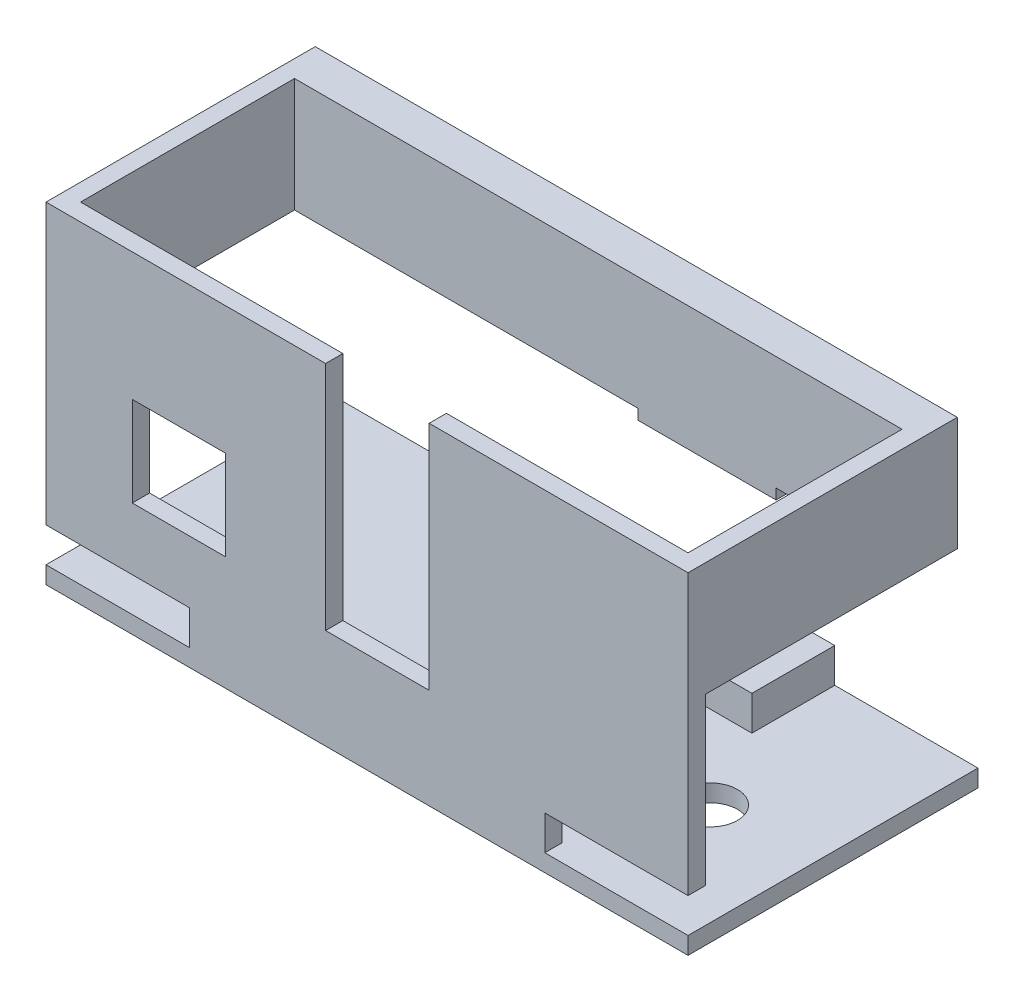
ISO-10303-21;
HEADER;
FILE_DESCRIPTION(('STEP AP214'),'2;1');
FILE_NAME('part.step','',(''),(''),'','','');
FILE_SCHEMA(('AUTOMOTIVE_DESIGN { 1 0 10303 214 1 1 1 1 }'));
ENDSEC;
DATA;
#1=APPLICATION_CONTEXT('core data for automotive mechanical design processes');
#2=APPLICATION_PROTOCOL_DEFINITION('international standard','automotive_design',2000,#1);
#3=PRODUCT_CONTEXT('',#1,'mechanical');
#4=PRODUCT('Part','Part','',(#3));
#5=PRODUCT_RELATED_PRODUCT_CATEGORY('part','',(#4));
#6=PRODUCT_DEFINITION_FORMATION('','',#4);
#7=PRODUCT_DEFINITION_CONTEXT('part definition',#1,'design');
#8=PRODUCT_DEFINITION('design','',#6,#7);
#9=PRODUCT_DEFINITION_SHAPE('','',#8);
#10=(LENGTH_UNIT() NAMED_UNIT(*) SI_UNIT(.MILLI.,.METRE.));
#11=(NAMED_UNIT(*) PLANE_ANGLE_UNIT() SI_UNIT($,.RADIAN.));
#12=(NAMED_UNIT(*) SI_UNIT($,.STERADIAN.) SOLID_ANGLE_UNIT());
#13=UNCERTAINTY_MEASURE_WITH_UNIT(LENGTH_MEASURE(1.E-05),#10,'distance_accuracy_value','');
#14=(GEOMETRIC_REPRESENTATION_CONTEXT(3) GLOBAL_UNCERTAINTY_ASSIGNED_CONTEXT((#13)) GLOBAL_UNIT_ASSIGNED_CONTEXT((#10,
#11,#12)) REPRESENTATION_CONTEXT('',''));
#15=CARTESIAN_POINT('',(0.,0.,0.));
#16=DIRECTION('',(0.,0.,1.));
#17=DIRECTION('',(1.,0.,0.));
#18=AXIS2_PLACEMENT_3D('',#15,#16,#17);
#19=CARTESIAN_POINT('',(45.25,15.75,-21.));
#20=DIRECTION('',(0.,1.,0.));
#21=DIRECTION('',(0.,0.,1.));
#22=AXIS2_PLACEMENT_3D('',#19,#20,#21);
#23=PLANE('',#22);
#24=DIRECTION('',(0.,0.,1.));
#25=VECTOR('',#24,1.);
#26=CARTESIAN_POINT('',(34.875,15.75,-19.5));
#27=LINE('',#26,#25);
#28=CARTESIAN_POINT('',(34.875,15.75,-19.5));
#29=VERTEX_POINT('',#28);
#30=CARTESIAN_POINT('',(34.875,15.75,-16.75));
#31=VERTEX_POINT('',#30);
#32=EDGE_CURVE('E48',#29,#31,#27,.T.);
#33=ORIENTED_EDGE('',*,*,#32,.F.);
#34=DIRECTION('',(1.,0.,0.));
#35=VECTOR('',#34,1.);
#36=CARTESIAN_POINT('',(45.25,15.75,-19.5));
#37=LINE('',#36,#35);
#38=CARTESIAN_POINT('',(45.25,15.75,-19.5));
#39=VERTEX_POINT('',#38);
#40=EDGE_CURVE('E41',#29,#39,#37,.T.);
#41=ORIENTED_EDGE('',*,*,#40,.T.);
#42=DIRECTION('',(0.,0.,-1.));
#43=VECTOR('',#42,1.);
#44=CARTESIAN_POINT('',(45.25,15.75,-21.));
#45=LINE('',#44,#43);
#46=CARTESIAN_POINT('',(45.25,15.75,-1.25));
#47=VERTEX_POINT('',#46);
#48=EDGE_CURVE('E434',#47,#39,#45,.T.);
#49=ORIENTED_EDGE('',*,*,#48,.F.);
#50=DIRECTION('',(-1.,0.,0.));
#51=VECTOR('',#50,1.);
#52=CARTESIAN_POINT('',(45.25,15.75,-1.25));
#53=LINE('',#52,#51);
#54=CARTESIAN_POINT('',(44.,15.75,-1.25));
#55=VERTEX_POINT('',#54);
#56=EDGE_CURVE('E442',#47,#55,#53,.T.);
#57=ORIENTED_EDGE('',*,*,#56,.T.);
#58=DIRECTION('',(0.,0.,1.));
#59=VECTOR('',#58,1.);
#60=CARTESIAN_POINT('',(44.,15.75,-21.));
#61=LINE('',#60,#59);
#62=CARTESIAN_POINT('',(44.,15.75,-16.75));
#63=VERTEX_POINT('',#62);
#64=EDGE_CURVE('E445',#63,#55,#61,.T.);
#65=ORIENTED_EDGE('',*,*,#64,.F.);
#66=DIRECTION('',(-1.,0.,0.));
#67=VECTOR('',#66,1.);
#68=CARTESIAN_POINT('',(44.,15.75,-16.75));
#69=LINE('',#68,#67);
#70=EDGE_CURVE('E288',#63,#31,#69,.T.);
#71=ORIENTED_EDGE('',*,*,#70,.T.);
#72=EDGE_LOOP('',(#33,#41,#49,#57,#65,#71));
#73=FACE_BOUND('',#72,.T.);
#74=ADVANCED_FACE('F33',(#73),#23,.F.);
#75=CARTESIAN_POINT('',(0.,0.,-21.));
#76=DIRECTION('',(-1.,0.,0.));
#77=DIRECTION('',(0.,0.,1.));
#78=AXIS2_PLACEMENT_3D('',#75,#76,#77);
#79=PLANE('',#78);
#80=DIRECTION('',(0.,-1.,0.));
#81=VECTOR('',#80,1.);
#82=CARTESIAN_POINT('',(0.,24.,-16.75));
#83=LINE('',#82,#81);
#84=CARTESIAN_POINT('',(0.,24.,-16.75));
#85=VERTEX_POINT('',#84);
#86=CARTESIAN_POINT('',(0.,15.75,-16.75));
#87=VERTEX_POINT('',#86);
#88=EDGE_CURVE('E278',#85,#87,#83,.T.);
#89=ORIENTED_EDGE('',*,*,#88,.F.);
#90=DIRECTION('',(0.,0.,1.));
#91=VECTOR('',#90,1.);
#92=CARTESIAN_POINT('',(0.,24.,-21.));
#93=LINE('',#92,#91);
#94=CARTESIAN_POINT('',(0.,24.,-1.25));
#95=VERTEX_POINT('',#94);
#96=EDGE_CURVE('E465',#85,#95,#93,.T.);
#97=ORIENTED_EDGE('',*,*,#96,.T.);
#98=DIRECTION('',(0.,-1.,0.));
#99=VECTOR('',#98,1.);
#100=CARTESIAN_POINT('',(0.,0.,-1.25));
#101=LINE('',#100,#99);
#102=CARTESIAN_POINT('',(0.,15.75,-1.25));
#103=VERTEX_POINT('',#102);
#104=EDGE_CURVE('E453',#95,#103,#101,.T.);
#105=ORIENTED_EDGE('',*,*,#104,.T.);
#106=DIRECTION('',(0.,0.,-1.));
#107=VECTOR('',#106,1.);
#108=CARTESIAN_POINT('',(0.,15.75,-21.));
#109=LINE('',#108,#107);
#110=EDGE_CURVE('E447',#103,#87,#109,.T.);
#111=ORIENTED_EDGE('',*,*,#110,.T.);
#112=EDGE_LOOP('',(#89,#97,#105,#111));
#113=FACE_BOUND('',#112,.T.);
#114=ADVANCED_FACE('F535',(#113),#79,.F.);
#115=CARTESIAN_POINT('',(44.,0.,-21.));
#116=DIRECTION('',(1.,0.,0.));
#117=DIRECTION('',(0.,0.,-1.));
#118=AXIS2_PLACEMENT_3D('',#115,#116,#117);
#119=PLANE('',#118);
#120=DIRECTION('',(0.,-1.,0.));
#121=VECTOR('',#120,1.);
#122=CARTESIAN_POINT('',(44.,24.,-16.75));
#123=LINE('',#122,#121);
#124=CARTESIAN_POINT('',(44.,24.,-16.75));
#125=VERTEX_POINT('',#124);
#126=EDGE_CURVE('E280',#125,#63,#123,.T.);
#127=ORIENTED_EDGE('',*,*,#126,.T.);
#128=ORIENTED_EDGE('',*,*,#64,.T.);
#129=DIRECTION('',(0.,1.,0.));
#130=VECTOR('',#129,1.);
#131=CARTESIAN_POINT('',(44.,0.,-1.25));
#132=LINE('',#131,#130);
#133=CARTESIAN_POINT('',(44.,24.,-1.25));
#134=VERTEX_POINT('',#133);
#135=EDGE_CURVE('E452',#55,#134,#132,.T.);
#136=ORIENTED_EDGE('',*,*,#135,.T.);
#137=DIRECTION('',(0.,0.,1.));
#138=VECTOR('',#137,1.);
#139=CARTESIAN_POINT('',(44.,24.,-21.));
#140=LINE('',#139,#138);
#141=EDGE_CURVE('E464',#125,#134,#140,.T.);
#142=ORIENTED_EDGE('',*,*,#141,.F.);
#143=EDGE_LOOP('',(#127,#128,#136,#142));
#144=FACE_BOUND('',#143,.T.);
#145=ADVANCED_FACE('F604',(#144),#119,.F.);
#146=CARTESIAN_POINT('',(-1.25,1.25,-21.));
#147=DIRECTION('',(0.,-1.,0.));
#148=DIRECTION('',(0.,0.,-1.));
#149=AXIS2_PLACEMENT_3D('',#146,#147,#148);
#150=PLANE('',#149);
#151=CARTESIAN_POINT('',(6.125,1.25,-8.99999999999999));
#152=DIRECTION('',(0.,-1.,0.));
#153=DIRECTION('',(0.,0.,-1.));
#154=AXIS2_PLACEMENT_3D('',#151,#152,#153);
#155=CIRCLE('',#154,1.95);
#156=CARTESIAN_POINT('',(6.125,1.25,-10.95));
#157=VERTEX_POINT('',#156);
#158=EDGE_CURVE('E376',#157,#157,#155,.T.);
#159=ORIENTED_EDGE('',*,*,#158,.T.);
#160=EDGE_LOOP('',(#159));
#161=FACE_BOUND('',#160,.T.);
#162=CARTESIAN_POINT('',(37.875,1.25,-8.99999999999999));
#163=DIRECTION('',(0.,-1.,0.));
#164=DIRECTION('',(0.,0.,-1.));
#165=AXIS2_PLACEMENT_3D('',#162,#163,#164);
#166=CIRCLE('',#165,1.95);
#167=CARTESIAN_POINT('',(37.875,1.25,-10.95));
#168=VERTEX_POINT('',#167);
#169=EDGE_CURVE('E367',#168,#168,#166,.F.);
#170=ORIENTED_EDGE('',*,*,#169,.F.);
#171=EDGE_LOOP('',(#170));
#172=FACE_BOUND('',#171,.T.);
#173=DIRECTION('',(0.,0.,-1.));
#174=VECTOR('',#173,1.);
#175=CARTESIAN_POINT('',(34.875,1.25,-21.));
#176=LINE('',#175,#174);
#177=CARTESIAN_POINT('',(34.875,1.25,-15.));
#178=VERTEX_POINT('',#177);
#179=CARTESIAN_POINT('',(34.875,1.25,-21.));
#180=VERTEX_POINT('',#179);
#181=EDGE_CURVE('E301',#178,#180,#176,.T.);
#182=ORIENTED_EDGE('',*,*,#181,.F.);
#183=DIRECTION('',(1.,0.,0.));
#184=VECTOR('',#183,1.);
#185=CARTESIAN_POINT('',(34.875,1.25,-15.));
#186=LINE('',#185,#184);
#187=CARTESIAN_POINT('',(15.375,1.25,-15.));
#188=VERTEX_POINT('',#187);
#189=EDGE_CURVE('E306',#188,#178,#186,.T.);
#190=ORIENTED_EDGE('',*,*,#189,.F.);
#191=DIRECTION('',(0.,0.,1.));
#192=VECTOR('',#191,1.);
#193=CARTESIAN_POINT('',(15.375,1.25,-21.));
#194=LINE('',#193,#192);
#195=CARTESIAN_POINT('',(15.375,1.25,-21.));
#196=VERTEX_POINT('',#195);
#197=EDGE_CURVE('E314',#196,#188,#194,.T.);
#198=ORIENTED_EDGE('',*,*,#197,.F.);
#199=DIRECTION('',(1.,0.,0.));
#200=VECTOR('',#199,1.);
#201=CARTESIAN_POINT('',(0.,1.25,-21.));
#202=LINE('',#201,#200);
#203=CARTESIAN_POINT('',(-1.25,1.25,-21.));
#204=VERTEX_POINT('',#203);
#205=EDGE_CURVE('E461',#204,#196,#202,.T.);
#206=ORIENTED_EDGE('',*,*,#205,.F.);
#207=DIRECTION('',(0.,0.,1.));
#208=VECTOR('',#207,1.);
#209=CARTESIAN_POINT('',(-1.25,1.25,-21.));
#210=LINE('',#209,#208);
#211=CARTESIAN_POINT('',(-1.25000000000002,1.25,0.));
#212=VERTEX_POINT('',#211);
#213=EDGE_CURVE('E428',#204,#212,#210,.T.);
#214=ORIENTED_EDGE('',*,*,#213,.T.);
#215=DIRECTION('',(1.,0.,0.));
#216=VECTOR('',#215,1.);
#217=CARTESIAN_POINT('',(-1.25000000000002,1.25,0.));
#218=LINE('',#217,#216);
#219=CARTESIAN_POINT('',(9.125,1.25000000000001,0.));
#220=VERTEX_POINT('',#219);
#221=EDGE_CURVE('E327',#212,#220,#218,.T.);
#222=ORIENTED_EDGE('',*,*,#221,.T.);
#223=DIRECTION('',(0.,0.,1.));
#224=VECTOR('',#223,1.);
#225=CARTESIAN_POINT('',(9.125,1.25000000000001,-11.9219550692458));
#226=LINE('',#225,#224);
#227=CARTESIAN_POINT('',(9.125,1.25000000000001,-1.25));
#228=VERTEX_POINT('',#227);
#229=EDGE_CURVE('E340',#228,#220,#226,.T.);
#230=ORIENTED_EDGE('',*,*,#229,.F.);
#231=DIRECTION('',(1.,0.,0.));
#232=VECTOR('',#231,1.);
#233=CARTESIAN_POINT('',(0.,1.25,-1.25));
#234=LINE('',#233,#232);
#235=CARTESIAN_POINT('',(34.875,1.25000000000001,-1.25));
#236=VERTEX_POINT('',#235);
#237=EDGE_CURVE('E450',#228,#236,#234,.T.);
#238=ORIENTED_EDGE('',*,*,#237,.T.);
#239=DIRECTION('',(0.,0.,1.));
#240=VECTOR('',#239,1.);
#241=CARTESIAN_POINT('',(34.875,1.25000000000001,-11.9219550692458));
#242=LINE('',#241,#240);
#243=CARTESIAN_POINT('',(34.875,1.25000000000001,0.));
#244=VERTEX_POINT('',#243);
#245=EDGE_CURVE('E352',#236,#244,#242,.T.);
#246=ORIENTED_EDGE('',*,*,#245,.T.);
#247=DIRECTION('',(1.,0.,0.));
#248=VECTOR('',#247,1.);
#249=CARTESIAN_POINT('',(45.25,1.25,0.));
#250=LINE('',#249,#248);
#251=CARTESIAN_POINT('',(45.25,1.25,0.));
#252=VERTEX_POINT('',#251);
#253=EDGE_CURVE('E358',#244,#252,#250,.T.);
#254=ORIENTED_EDGE('',*,*,#253,.T.);
#255=DIRECTION('',(0.,0.,1.));
#256=VECTOR('',#255,1.);
#257=CARTESIAN_POINT('',(45.25,1.25,-21.));
#258=LINE('',#257,#256);
#259=CARTESIAN_POINT('',(45.25,1.25,-21.));
#260=VERTEX_POINT('',#259);
#261=EDGE_CURVE('E429',#260,#252,#258,.T.);
#262=ORIENTED_EDGE('',*,*,#261,.F.);
#263=EDGE_CURVE('E456',#180,#260,#202,.T.);
#264=ORIENTED_EDGE('',*,*,#263,.F.);
#265=EDGE_LOOP('',(#182,#190,#198,#206,#214,#222,#230,#238,#246,#254,#262,#264));
#266=FACE_BOUND('',#265,.T.);
#267=ADVANCED_FACE('F583',(#161,#172,#266),#150,.F.);
#268=CARTESIAN_POINT('',(-1.25,0.,-21.));
#269=DIRECTION('',(-1.,0.,0.));
#270=DIRECTION('',(0.,0.,1.));
#271=AXIS2_PLACEMENT_3D('',#268,#269,#270);
#272=PLANE('',#271);
#273=DIRECTION('',(0.,-1.,0.));
#274=VECTOR('',#273,1.);
#275=CARTESIAN_POINT('',(-1.25,0.,0.));
#276=LINE('',#275,#274);
#277=CARTESIAN_POINT('',(-1.25,0.,0.));
#278=VERTEX_POINT('',#277);
#279=EDGE_CURVE('E491',#212,#278,#276,.T.);
#280=ORIENTED_EDGE('',*,*,#279,.F.);
#281=ORIENTED_EDGE('',*,*,#213,.F.);
#282=DIRECTION('',(0.,-1.,0.));
#283=VECTOR('',#282,1.);
#284=CARTESIAN_POINT('',(-1.25,0.,-21.));
#285=LINE('',#284,#283);
#286=CARTESIAN_POINT('',(-1.25,0.,-21.));
#287=VERTEX_POINT('',#286);
#288=EDGE_CURVE('E478',#204,#287,#285,.T.);
#289=ORIENTED_EDGE('',*,*,#288,.T.);
#290=DIRECTION('',(0.,0.,1.));
#291=VECTOR('',#290,1.);
#292=CARTESIAN_POINT('',(-1.25,0.,-21.));
#293=LINE('',#292,#291);
#294=EDGE_CURVE('E494',#287,#278,#293,.T.);
#295=ORIENTED_EDGE('',*,*,#294,.T.);
#296=EDGE_LOOP('',(#280,#281,#289,#295));
#297=FACE_BOUND('',#296,.T.);
#298=ADVANCED_FACE('F629',(#297),#272,.T.);
#299=CARTESIAN_POINT('',(45.25,0.,-21.));
#300=DIRECTION('',(1.,0.,0.));
#301=DIRECTION('',(0.,0.,-1.));
#302=AXIS2_PLACEMENT_3D('',#299,#300,#301);
#303=PLANE('',#302);
#304=ORIENTED_EDGE('',*,*,#261,.T.);
#305=DIRECTION('',(0.,1.,0.));
#306=VECTOR('',#305,1.);
#307=CARTESIAN_POINT('',(45.25,0.,0.));
#308=LINE('',#307,#306);
#309=CARTESIAN_POINT('',(45.25,0.,0.));
#310=VERTEX_POINT('',#309);
#311=EDGE_CURVE('E484',#310,#252,#308,.T.);
#312=ORIENTED_EDGE('',*,*,#311,.F.);
#313=DIRECTION('',(0.,0.,1.));
#314=VECTOR('',#313,1.);
#315=CARTESIAN_POINT('',(45.25,0.,-21.));
#316=LINE('',#315,#314);
#317=CARTESIAN_POINT('',(45.25,0.,-21.));
#318=VERTEX_POINT('',#317);
#319=EDGE_CURVE('E480',#318,#310,#316,.T.);
#320=ORIENTED_EDGE('',*,*,#319,.F.);
#321=DIRECTION('',(0.,1.,0.));
#322=VECTOR('',#321,1.);
#323=CARTESIAN_POINT('',(45.25,0.,-21.));
#324=LINE('',#323,#322);
#325=EDGE_CURVE('E474',#318,#260,#324,.T.);
#326=ORIENTED_EDGE('',*,*,#325,.T.);
#327=EDGE_LOOP('',(#304,#312,#320,#326));
#328=FACE_BOUND('',#327,.T.);
#329=ADVANCED_FACE('F632',(#328),#303,.T.);
#330=CARTESIAN_POINT('',(-1.25,0.,-21.));
#331=DIRECTION('',(0.,-1.,0.));
#332=DIRECTION('',(0.,0.,-1.));
#333=AXIS2_PLACEMENT_3D('',#330,#331,#332);
#334=PLANE('',#333);
#335=CARTESIAN_POINT('',(37.875,0.,-8.99999999999999));
#336=DIRECTION('',(0.,-1.,0.));
#337=DIRECTION('',(0.,0.,-1.));
#338=AXIS2_PLACEMENT_3D('',#335,#336,#337);
#339=CIRCLE('',#338,1.95);
#340=CARTESIAN_POINT('',(37.875,0.,-10.95));
#341=VERTEX_POINT('',#340);
#342=EDGE_CURVE('E370',#341,#341,#339,.T.);
#343=ORIENTED_EDGE('',*,*,#342,.F.);
#344=EDGE_LOOP('',(#343));
#345=FACE_BOUND('',#344,.T.);
#346=DIRECTION('',(1.,0.,0.));
#347=VECTOR('',#346,1.);
#348=CARTESIAN_POINT('',(-1.25,0.,0.));
#349=LINE('',#348,#347);
#350=EDGE_CURVE('E467',#278,#310,#349,.T.);
#351=ORIENTED_EDGE('',*,*,#350,.F.);
#352=ORIENTED_EDGE('',*,*,#294,.F.);
#353=DIRECTION('',(1.,0.,0.));
#354=VECTOR('',#353,1.);
#355=CARTESIAN_POINT('',(-1.25,0.,-21.));
#356=LINE('',#355,#354);
#357=EDGE_CURVE('E471',#287,#318,#356,.T.);
#358=ORIENTED_EDGE('',*,*,#357,.T.);
#359=ORIENTED_EDGE('',*,*,#319,.T.);
#360=EDGE_LOOP('',(#351,#352,#358,#359));
#361=FACE_BOUND('',#360,.T.);
#362=CARTESIAN_POINT('',(6.125,0.,-8.99999999999999));
#363=DIRECTION('',(0.,-1.,0.));
#364=DIRECTION('',(0.,0.,-1.));
#365=AXIS2_PLACEMENT_3D('',#362,#363,#364);
#366=CIRCLE('',#365,1.95);
#367=CARTESIAN_POINT('',(6.125,0.,-10.95));
#368=VERTEX_POINT('',#367);
#369=EDGE_CURVE('E373',#368,#368,#366,.F.);
#370=ORIENTED_EDGE('',*,*,#369,.T.);
#371=EDGE_LOOP('',(#370));
#372=FACE_BOUND('',#371,.T.);
#373=ADVANCED_FACE('F35',(#345,#361,#372),#334,.T.);
#374=CARTESIAN_POINT('',(-1.25,24.,-21.));
#375=DIRECTION('',(0.,1.,0.));
#376=DIRECTION('',(0.,0.,1.));
#377=AXIS2_PLACEMENT_3D('',#374,#375,#376);
#378=PLANE('',#377);
#379=DIRECTION('',(0.,0.,1.));
#380=VECTOR('',#379,1.);
#381=CARTESIAN_POINT('',(45.25,24.,-21.));
#382=LINE('',#381,#380);
#383=CARTESIAN_POINT('',(45.25,24.,-19.5));
#384=VERTEX_POINT('',#383);
#385=CARTESIAN_POINT('',(45.25,24.,0.));
#386=VERTEX_POINT('',#385);
#387=EDGE_CURVE('E500',#384,#386,#382,.T.);
#388=ORIENTED_EDGE('',*,*,#387,.F.);
#389=DIRECTION('',(-1.,0.,0.));
#390=VECTOR('',#389,1.);
#391=CARTESIAN_POINT('',(45.25,24.,-19.5));
#392=LINE('',#391,#390);
#393=CARTESIAN_POINT('',(-1.25000000000002,24.,-19.5));
#394=VERTEX_POINT('',#393);
#395=EDGE_CURVE('E298',#384,#394,#392,.T.);
#396=ORIENTED_EDGE('',*,*,#395,.T.);
#397=DIRECTION('',(0.,0.,1.));
#398=VECTOR('',#397,1.);
#399=CARTESIAN_POINT('',(-1.25,24.,-21.));
#400=LINE('',#399,#398);
#401=CARTESIAN_POINT('',(-1.25,24.,0.));
#402=VERTEX_POINT('',#401);
#403=EDGE_CURVE('E498',#394,#402,#400,.T.);
#404=ORIENTED_EDGE('',*,*,#403,.T.);
#405=DIRECTION('',(-1.,0.,0.));
#406=VECTOR('',#405,1.);
#407=CARTESIAN_POINT('',(-1.25,24.,0.));
#408=LINE('',#407,#406);
#409=CARTESIAN_POINT('',(19.,24.,0.));
#410=VERTEX_POINT('',#409);
#411=EDGE_CURVE('E487',#410,#402,#408,.T.);
#412=ORIENTED_EDGE('',*,*,#411,.F.);
#413=DIRECTION('',(0.,0.,1.));
#414=VECTOR('',#413,1.);
#415=CARTESIAN_POINT('',(19.,24.,-21.));
#416=LINE('',#415,#414);
#417=CARTESIAN_POINT('',(19.,24.,-1.25));
#418=VERTEX_POINT('',#417);
#419=EDGE_CURVE('E397',#418,#410,#416,.T.);
#420=ORIENTED_EDGE('',*,*,#419,.F.);
#421=DIRECTION('',(-1.,0.,0.));
#422=VECTOR('',#421,1.);
#423=CARTESIAN_POINT('',(0.,24.,-1.25));
#424=LINE('',#423,#422);
#425=EDGE_CURVE('E460',#418,#95,#424,.T.);
#426=ORIENTED_EDGE('',*,*,#425,.T.);
#427=ORIENTED_EDGE('',*,*,#96,.F.);
#428=DIRECTION('',(-1.,0.,0.));
#429=VECTOR('',#428,1.);
#430=CARTESIAN_POINT('',(44.,24.,-16.75));
#431=LINE('',#430,#429);
#432=EDGE_CURVE('E290',#125,#85,#431,.T.);
#433=ORIENTED_EDGE('',*,*,#432,.F.);
#434=ORIENTED_EDGE('',*,*,#141,.T.);
#435=CARTESIAN_POINT('',(26.5,24.,-1.25));
#436=VERTEX_POINT('',#435);
#437=EDGE_CURVE('E457',#134,#436,#424,.T.);
#438=ORIENTED_EDGE('',*,*,#437,.T.);
#439=DIRECTION('',(0.,0.,-1.));
#440=VECTOR('',#439,1.);
#441=CARTESIAN_POINT('',(26.5,24.,-21.));
#442=LINE('',#441,#440);
#443=CARTESIAN_POINT('',(26.5,24.,0.));
#444=VERTEX_POINT('',#443);
#445=EDGE_CURVE('E395',#444,#436,#442,.T.);
#446=ORIENTED_EDGE('',*,*,#445,.F.);
#447=EDGE_CURVE('E488',#386,#444,#408,.T.);
#448=ORIENTED_EDGE('',*,*,#447,.F.);
#449=EDGE_LOOP('',(#388,#396,#404,#412,#420,#426,#427,#433,#434,#438,#446,#448));
#450=FACE_BOUND('',#449,.T.);
#451=ADVANCED_FACE('F529',(#450),#378,.T.);
#452=DIRECTION('',(0.,1.,0.));
#453=VECTOR('',#452,1.);
#454=CARTESIAN_POINT('',(-1.25000000000002,0.,-19.5));
#455=LINE('',#454,#453);
#456=CARTESIAN_POINT('',(-1.25000000000002,15.75,-19.5));
#457=VERTEX_POINT('',#456);
#458=EDGE_CURVE('E293',#457,#394,#455,.T.);
#459=ORIENTED_EDGE('',*,*,#458,.F.);
#460=DIRECTION('',(0.,0.,-1.));
#461=VECTOR('',#460,1.);
#462=CARTESIAN_POINT('',(-1.25,15.75,-21.));
#463=LINE('',#462,#461);
#464=CARTESIAN_POINT('',(-1.25,15.75,-1.25));
#465=VERTEX_POINT('',#464);
#466=EDGE_CURVE('E432',#465,#457,#463,.T.);
#467=ORIENTED_EDGE('',*,*,#466,.F.);
#468=DIRECTION('',(0.,1.,0.));
#469=VECTOR('',#468,1.);
#470=CARTESIAN_POINT('',(-1.25,1.25,-1.25));
#471=LINE('',#470,#469);
#472=CARTESIAN_POINT('',(-1.25000000000002,3.75,-1.25));
#473=VERTEX_POINT('',#472);
#474=EDGE_CURVE('E439',#473,#465,#471,.T.);
#475=ORIENTED_EDGE('',*,*,#474,.F.);
#476=DIRECTION('',(0.,0.,1.));
#477=VECTOR('',#476,1.);
#478=CARTESIAN_POINT('',(-1.25000000000002,3.75,-11.9219550692458));
#479=LINE('',#478,#477);
#480=CARTESIAN_POINT('',(-1.25000000000002,3.75,0.));
#481=VERTEX_POINT('',#480);
#482=EDGE_CURVE('E332',#473,#481,#479,.T.);
#483=ORIENTED_EDGE('',*,*,#482,.T.);
#484=EDGE_CURVE('E475',#402,#481,#276,.T.);
#485=ORIENTED_EDGE('',*,*,#484,.F.);
#486=ORIENTED_EDGE('',*,*,#403,.F.);
#487=EDGE_LOOP('',(#459,#467,#475,#483,#485,#486));
#488=FACE_BOUND('',#487,.T.);
#489=ADVANCED_FACE('F550',(#488),#272,.T.);
#490=DIRECTION('',(0.,1.,0.));
#491=VECTOR('',#490,1.);
#492=CARTESIAN_POINT('',(45.25,0.,-19.5));
#493=LINE('',#492,#491);
#494=EDGE_CURVE('E295',#39,#384,#493,.T.);
#495=ORIENTED_EDGE('',*,*,#494,.T.);
#496=ORIENTED_EDGE('',*,*,#387,.T.);
#497=CARTESIAN_POINT('',(45.25,3.75,0.));
#498=VERTEX_POINT('',#497);
#499=EDGE_CURVE('E483',#498,#386,#308,.T.);
#500=ORIENTED_EDGE('',*,*,#499,.F.);
#501=DIRECTION('',(0.,0.,1.));
#502=VECTOR('',#501,1.);
#503=CARTESIAN_POINT('',(45.25,3.75,-11.9219550692458));
#504=LINE('',#503,#502);
#505=CARTESIAN_POINT('',(45.25,3.75,-1.25));
#506=VERTEX_POINT('',#505);
#507=EDGE_CURVE('E361',#506,#498,#504,.T.);
#508=ORIENTED_EDGE('',*,*,#507,.F.);
#509=DIRECTION('',(0.,1.,0.));
#510=VECTOR('',#509,1.);
#511=CARTESIAN_POINT('',(45.25,1.25,-1.25));
#512=LINE('',#511,#510);
#513=EDGE_CURVE('E431',#506,#47,#512,.T.);
#514=ORIENTED_EDGE('',*,*,#513,.T.);
#515=ORIENTED_EDGE('',*,*,#48,.T.);
#516=EDGE_LOOP('',(#495,#496,#500,#508,#514,#515));
#517=FACE_BOUND('',#516,.T.);
#518=ADVANCED_FACE('F513',(#517),#303,.T.);
#519=CARTESIAN_POINT('',(0.,0.,-21.));
#520=DIRECTION('',(0.,0.,1.));
#521=DIRECTION('',(1.,0.,0.));
#522=AXIS2_PLACEMENT_3D('',#519,#520,#521);
#523=PLANE('',#522);
#524=ORIENTED_EDGE('',*,*,#288,.F.);
#525=ORIENTED_EDGE('',*,*,#205,.T.);
#526=DIRECTION('',(0.,-1.,0.));
#527=VECTOR('',#526,1.);
#528=CARTESIAN_POINT('',(15.375,3.75,-21.));
#529=LINE('',#528,#527);
#530=CARTESIAN_POINT('',(15.375,3.75,-21.));
#531=VERTEX_POINT('',#530);
#532=EDGE_CURVE('E322',#531,#196,#529,.T.);
#533=ORIENTED_EDGE('',*,*,#532,.F.);
#534=DIRECTION('',(-1.,0.,0.));
#535=VECTOR('',#534,1.);
#536=CARTESIAN_POINT('',(34.875,3.75,-21.));
#537=LINE('',#536,#535);
#538=CARTESIAN_POINT('',(34.875,3.75,-21.));
#539=VERTEX_POINT('',#538);
#540=EDGE_CURVE('E305',#539,#531,#537,.T.);
#541=ORIENTED_EDGE('',*,*,#540,.F.);
#542=DIRECTION('',(0.,-1.,0.));
#543=VECTOR('',#542,1.);
#544=CARTESIAN_POINT('',(34.875,3.75,-21.));
#545=LINE('',#544,#543);
#546=EDGE_CURVE('E324',#539,#180,#545,.T.);
#547=ORIENTED_EDGE('',*,*,#546,.T.);
#548=ORIENTED_EDGE('',*,*,#263,.T.);
#549=ORIENTED_EDGE('',*,*,#325,.F.);
#550=ORIENTED_EDGE('',*,*,#357,.F.);
#551=EDGE_LOOP('',(#524,#525,#533,#541,#547,#548,#549,#550));
#552=FACE_BOUND('',#551,.T.);
#553=ADVANCED_FACE('F620',(#552),#523,.F.);
#554=CARTESIAN_POINT('',(0.,0.,0.));
#555=DIRECTION('',(0.,0.,1.));
#556=DIRECTION('',(1.,0.,0.));
#557=AXIS2_PLACEMENT_3D('',#554,#555,#556);
#558=PLANE('',#557);
#559=ORIENTED_EDGE('',*,*,#221,.F.);
#560=ORIENTED_EDGE('',*,*,#279,.T.);
#561=ORIENTED_EDGE('',*,*,#350,.T.);
#562=ORIENTED_EDGE('',*,*,#311,.T.);
#563=ORIENTED_EDGE('',*,*,#253,.F.);
#564=DIRECTION('',(0.,-1.,0.));
#565=VECTOR('',#564,1.);
#566=CARTESIAN_POINT('',(34.875,1.25000000000001,0.));
#567=LINE('',#566,#565);
#568=CARTESIAN_POINT('',(34.875,3.75000000000001,0.));
#569=VERTEX_POINT('',#568);
#570=EDGE_CURVE('E355',#569,#244,#567,.T.);
#571=ORIENTED_EDGE('',*,*,#570,.F.);
#572=DIRECTION('',(-1.,0.,0.));
#573=VECTOR('',#572,1.);
#574=CARTESIAN_POINT('',(45.25,3.75,0.));
#575=LINE('',#574,#573);
#576=EDGE_CURVE('E347',#498,#569,#575,.T.);
#577=ORIENTED_EDGE('',*,*,#576,.F.);
#578=ORIENTED_EDGE('',*,*,#499,.T.);
#579=ORIENTED_EDGE('',*,*,#447,.T.);
#580=DIRECTION('',(0.,1.,0.));
#581=VECTOR('',#580,1.);
#582=CARTESIAN_POINT('',(26.5,24.25,0.));
#583=LINE('',#582,#581);
#584=CARTESIAN_POINT('',(26.5,7.25,0.));
#585=VERTEX_POINT('',#584);
#586=EDGE_CURVE('E388',#585,#444,#583,.T.);
#587=ORIENTED_EDGE('',*,*,#586,.F.);
#588=DIRECTION('',(1.,0.,0.));
#589=VECTOR('',#588,1.);
#590=CARTESIAN_POINT('',(19.,7.25,0.));
#591=LINE('',#590,#589);
#592=CARTESIAN_POINT('',(19.,7.25,0.));
#593=VERTEX_POINT('',#592);
#594=EDGE_CURVE('E385',#593,#585,#591,.T.);
#595=ORIENTED_EDGE('',*,*,#594,.F.);
#596=DIRECTION('',(0.,-1.,0.));
#597=VECTOR('',#596,1.);
#598=CARTESIAN_POINT('',(19.,24.25,0.));
#599=LINE('',#598,#597);
#600=EDGE_CURVE('E379',#410,#593,#599,.T.);
#601=ORIENTED_EDGE('',*,*,#600,.F.);
#602=ORIENTED_EDGE('',*,*,#411,.T.);
#603=ORIENTED_EDGE('',*,*,#484,.T.);
#604=DIRECTION('',(-1.,0.,0.));
#605=VECTOR('',#604,1.);
#606=CARTESIAN_POINT('',(-1.25000000000002,3.75,0.));
#607=LINE('',#606,#605);
#608=CARTESIAN_POINT('',(9.125,3.75000000000001,0.));
#609=VERTEX_POINT('',#608);
#610=EDGE_CURVE('E338',#609,#481,#607,.T.);
#611=ORIENTED_EDGE('',*,*,#610,.F.);
#612=DIRECTION('',(0.,1.,0.));
#613=VECTOR('',#612,1.);
#614=CARTESIAN_POINT('',(9.125,1.25000000000001,0.));
#615=LINE('',#614,#613);
#616=EDGE_CURVE('E335',#220,#609,#615,.T.);
#617=ORIENTED_EDGE('',*,*,#616,.F.);
#618=EDGE_LOOP('',(#559,#560,#561,#562,#563,#571,#577,#578,#579,#587,#595,#601,#602,#603,#611,#617));
#619=FACE_BOUND('',#618,.T.);
#620=DIRECTION('',(0.,-1.,0.));
#621=VECTOR('',#620,1.);
#622=CARTESIAN_POINT('',(5.,14.75,0.));
#623=LINE('',#622,#621);
#624=CARTESIAN_POINT('',(5.,14.75,0.));
#625=VERTEX_POINT('',#624);
#626=CARTESIAN_POINT('',(5.,8.25,0.));
#627=VERTEX_POINT('',#626);
#628=EDGE_CURVE('E399',#625,#627,#623,.T.);
#629=ORIENTED_EDGE('',*,*,#628,.F.);
#630=DIRECTION('',(-1.,0.,0.));
#631=VECTOR('',#630,1.);
#632=CARTESIAN_POINT('',(5.,14.75,0.));
#633=LINE('',#632,#631);
#634=CARTESIAN_POINT('',(11.75,14.75,0.));
#635=VERTEX_POINT('',#634);
#636=EDGE_CURVE('E416',#635,#625,#633,.T.);
#637=ORIENTED_EDGE('',*,*,#636,.F.);
#638=DIRECTION('',(0.,1.,0.));
#639=VECTOR('',#638,1.);
#640=CARTESIAN_POINT('',(11.75,14.75,0.));
#641=LINE('',#640,#639);
#642=CARTESIAN_POINT('',(11.75,8.25,0.));
#643=VERTEX_POINT('',#642);
#644=EDGE_CURVE('E413',#643,#635,#641,.T.);
#645=ORIENTED_EDGE('',*,*,#644,.F.);
#646=DIRECTION('',(1.,0.,0.));
#647=VECTOR('',#646,1.);
#648=CARTESIAN_POINT('',(5.,8.25,0.));
#649=LINE('',#648,#647);
#650=EDGE_CURVE('E410',#627,#643,#649,.T.);
#651=ORIENTED_EDGE('',*,*,#650,.F.);
#652=EDGE_LOOP('',(#629,#637,#645,#651));
#653=FACE_BOUND('',#652,.T.);
#654=ADVANCED_FACE('F561',(#619,#653),#558,.T.);
#655=CARTESIAN_POINT('',(0.,0.,-1.25));
#656=DIRECTION('',(0.,0.,1.));
#657=DIRECTION('',(1.,0.,0.));
#658=AXIS2_PLACEMENT_3D('',#655,#656,#657);
#659=PLANE('',#658);
#660=DIRECTION('',(0.,-1.,0.));
#661=VECTOR('',#660,1.);
#662=CARTESIAN_POINT('',(9.125,1.25000000000001,-1.25));
#663=LINE('',#662,#661);
#664=CARTESIAN_POINT('',(9.125,3.75000000000001,-1.25));
#665=VERTEX_POINT('',#664);
#666=EDGE_CURVE('E331',#665,#228,#663,.T.);
#667=ORIENTED_EDGE('',*,*,#666,.F.);
#668=DIRECTION('',(1.,0.,0.));
#669=VECTOR('',#668,1.);
#670=CARTESIAN_POINT('',(-1.25000000000002,3.75,-1.25));
#671=LINE('',#670,#669);
#672=EDGE_CURVE('E328',#473,#665,#671,.T.);
#673=ORIENTED_EDGE('',*,*,#672,.F.);
#674=ORIENTED_EDGE('',*,*,#474,.T.);
#675=EDGE_CURVE('E437',#103,#465,#53,.T.);
#676=ORIENTED_EDGE('',*,*,#675,.F.);
#677=ORIENTED_EDGE('',*,*,#104,.F.);
#678=ORIENTED_EDGE('',*,*,#425,.F.);
#679=DIRECTION('',(0.,1.,0.));
#680=VECTOR('',#679,1.);
#681=CARTESIAN_POINT('',(19.,24.25,-1.25));
#682=LINE('',#681,#680);
#683=CARTESIAN_POINT('',(19.,7.25,-1.25));
#684=VERTEX_POINT('',#683);
#685=EDGE_CURVE('E380',#684,#418,#682,.T.);
#686=ORIENTED_EDGE('',*,*,#685,.F.);
#687=DIRECTION('',(-1.,0.,0.));
#688=VECTOR('',#687,1.);
#689=CARTESIAN_POINT('',(19.,7.25,-1.25));
#690=LINE('',#689,#688);
#691=CARTESIAN_POINT('',(26.5,7.25,-1.25));
#692=VERTEX_POINT('',#691);
#693=EDGE_CURVE('E382',#692,#684,#690,.T.);
#694=ORIENTED_EDGE('',*,*,#693,.F.);
#695=DIRECTION('',(0.,1.,0.));
#696=VECTOR('',#695,1.);
#697=CARTESIAN_POINT('',(26.5,0.,-1.25));
#698=LINE('',#697,#696);
#699=EDGE_CURVE('E497',#692,#436,#698,.T.);
#700=ORIENTED_EDGE('',*,*,#699,.T.);
#701=ORIENTED_EDGE('',*,*,#437,.F.);
#702=ORIENTED_EDGE('',*,*,#135,.F.);
#703=ORIENTED_EDGE('',*,*,#56,.F.);
#704=ORIENTED_EDGE('',*,*,#513,.F.);
#705=DIRECTION('',(1.,0.,0.));
#706=VECTOR('',#705,1.);
#707=CARTESIAN_POINT('',(45.25,3.75,-1.25));
#708=LINE('',#707,#706);
#709=CARTESIAN_POINT('',(34.875,3.75000000000001,-1.25));
#710=VERTEX_POINT('',#709);
#711=EDGE_CURVE('E351',#710,#506,#708,.T.);
#712=ORIENTED_EDGE('',*,*,#711,.F.);
#713=DIRECTION('',(0.,1.,0.));
#714=VECTOR('',#713,1.);
#715=CARTESIAN_POINT('',(34.875,1.25000000000001,-1.25));
#716=LINE('',#715,#714);
#717=EDGE_CURVE('E348',#236,#710,#716,.T.);
#718=ORIENTED_EDGE('',*,*,#717,.F.);
#719=ORIENTED_EDGE('',*,*,#237,.F.);
#720=EDGE_LOOP('',(#667,#673,#674,#676,#677,#678,#686,#694,#700,#701,#702,#703,#704,#712,#718,#719));
#721=FACE_BOUND('',#720,.T.);
#722=DIRECTION('',(1.,0.,0.));
#723=VECTOR('',#722,1.);
#724=CARTESIAN_POINT('',(5.,14.75,-1.25));
#725=LINE('',#724,#723);
#726=CARTESIAN_POINT('',(5.,14.75,-1.25));
#727=VERTEX_POINT('',#726);
#728=CARTESIAN_POINT('',(11.75,14.75,-1.25));
#729=VERTEX_POINT('',#728);
#730=EDGE_CURVE('E403',#727,#729,#725,.T.);
#731=ORIENTED_EDGE('',*,*,#730,.F.);
#732=DIRECTION('',(0.,1.,0.));
#733=VECTOR('',#732,1.);
#734=CARTESIAN_POINT('',(5.,14.75,-1.25));
#735=LINE('',#734,#733);
#736=CARTESIAN_POINT('',(5.,8.25,-1.25));
#737=VERTEX_POINT('',#736);
#738=EDGE_CURVE('E406',#737,#727,#735,.T.);
#739=ORIENTED_EDGE('',*,*,#738,.F.);
#740=DIRECTION('',(-1.,0.,0.));
#741=VECTOR('',#740,1.);
#742=CARTESIAN_POINT('',(5.,8.25,-1.25));
#743=LINE('',#742,#741);
#744=CARTESIAN_POINT('',(11.75,8.25,-1.25));
#745=VERTEX_POINT('',#744);
#746=EDGE_CURVE('E408',#745,#737,#743,.T.);
#747=ORIENTED_EDGE('',*,*,#746,.F.);
#748=DIRECTION('',(0.,-1.,0.));
#749=VECTOR('',#748,1.);
#750=CARTESIAN_POINT('',(11.75,14.75,-1.25));
#751=LINE('',#750,#749);
#752=EDGE_CURVE('E400',#729,#745,#751,.T.);
#753=ORIENTED_EDGE('',*,*,#752,.F.);
#754=EDGE_LOOP('',(#731,#739,#747,#753));
#755=FACE_BOUND('',#754,.T.);
#756=ADVANCED_FACE('F521',(#721,#755),#659,.F.);
#757=CARTESIAN_POINT('',(24.875,15.75,-19.5));
#758=VERTEX_POINT('',#757);
#759=EDGE_CURVE('E11',#457,#758,#37,.T.);
#760=ORIENTED_EDGE('',*,*,#759,.T.);
#761=DIRECTION('',(0.,0.,1.));
#762=VECTOR('',#761,1.);
#763=CARTESIAN_POINT('',(24.875,15.75,-19.5));
#764=LINE('',#763,#762);
#765=CARTESIAN_POINT('',(24.875,15.75,-16.75));
#766=VERTEX_POINT('',#765);
#767=EDGE_CURVE('E275',#758,#766,#764,.T.);
#768=ORIENTED_EDGE('',*,*,#767,.T.);
#769=EDGE_CURVE('E286',#766,#87,#69,.T.);
#770=ORIENTED_EDGE('',*,*,#769,.T.);
#771=ORIENTED_EDGE('',*,*,#110,.F.);
#772=ORIENTED_EDGE('',*,*,#675,.T.);
#773=ORIENTED_EDGE('',*,*,#466,.T.);
#774=EDGE_LOOP('',(#760,#768,#770,#771,#772,#773));
#775=FACE_BOUND('',#774,.T.);
#776=ADVANCED_FACE('F537',(#775),#23,.F.);
#777=CARTESIAN_POINT('',(5.,14.75,-19.830904176062));
#778=DIRECTION('',(-1.,0.,0.));
#779=DIRECTION('',(0.,-1.,0.));
#780=AXIS2_PLACEMENT_3D('',#777,#778,#779);
#781=PLANE('',#780);
#782=ORIENTED_EDGE('',*,*,#738,.T.);
#783=DIRECTION('',(0.,0.,1.));
#784=VECTOR('',#783,1.);
#785=CARTESIAN_POINT('',(5.,14.75,-19.830904176062));
#786=LINE('',#785,#784);
#787=EDGE_CURVE('E404',#727,#625,#786,.T.);
#788=ORIENTED_EDGE('',*,*,#787,.T.);
#789=ORIENTED_EDGE('',*,*,#628,.T.);
#790=DIRECTION('',(0.,0.,1.));
#791=VECTOR('',#790,1.);
#792=CARTESIAN_POINT('',(5.,8.25,-19.830904176062));
#793=LINE('',#792,#791);
#794=EDGE_CURVE('E419',#737,#627,#793,.T.);
#795=ORIENTED_EDGE('',*,*,#794,.F.);
#796=EDGE_LOOP('',(#782,#788,#789,#795));
#797=FACE_BOUND('',#796,.T.);
#798=ADVANCED_FACE('F609',(#797),#781,.F.);
#799=CARTESIAN_POINT('',(5.,14.75,-19.830904176062));
#800=DIRECTION('',(0.,1.,0.));
#801=DIRECTION('',(0.,0.,1.));
#802=AXIS2_PLACEMENT_3D('',#799,#800,#801);
#803=PLANE('',#802);
#804=ORIENTED_EDGE('',*,*,#730,.T.);
#805=DIRECTION('',(0.,0.,1.));
#806=VECTOR('',#805,1.);
#807=CARTESIAN_POINT('',(11.75,14.75,-19.830904176062));
#808=LINE('',#807,#806);
#809=EDGE_CURVE('E421',#729,#635,#808,.T.);
#810=ORIENTED_EDGE('',*,*,#809,.T.);
#811=ORIENTED_EDGE('',*,*,#636,.T.);
#812=ORIENTED_EDGE('',*,*,#787,.F.);
#813=EDGE_LOOP('',(#804,#810,#811,#812));
#814=FACE_BOUND('',#813,.T.);
#815=ADVANCED_FACE('F614',(#814),#803,.F.);
#816=CARTESIAN_POINT('',(11.75,14.75,-19.830904176062));
#817=DIRECTION('',(1.,0.,0.));
#818=DIRECTION('',(0.,0.,-1.));
#819=AXIS2_PLACEMENT_3D('',#816,#817,#818);
#820=PLANE('',#819);
#821=ORIENTED_EDGE('',*,*,#752,.T.);
#822=DIRECTION('',(0.,0.,1.));
#823=VECTOR('',#822,1.);
#824=CARTESIAN_POINT('',(11.75,8.25,-19.830904176062));
#825=LINE('',#824,#823);
#826=EDGE_CURVE('E423',#745,#643,#825,.T.);
#827=ORIENTED_EDGE('',*,*,#826,.T.);
#828=ORIENTED_EDGE('',*,*,#644,.T.);
#829=ORIENTED_EDGE('',*,*,#809,.F.);
#830=EDGE_LOOP('',(#821,#827,#828,#829));
#831=FACE_BOUND('',#830,.T.);
#832=ADVANCED_FACE('F696',(#831),#820,.F.);
#833=CARTESIAN_POINT('',(5.,8.25,-19.830904176062));
#834=DIRECTION('',(0.,-1.,0.));
#835=DIRECTION('',(0.,0.,-1.));
#836=AXIS2_PLACEMENT_3D('',#833,#834,#835);
#837=PLANE('',#836);
#838=ORIENTED_EDGE('',*,*,#746,.T.);
#839=ORIENTED_EDGE('',*,*,#794,.T.);
#840=ORIENTED_EDGE('',*,*,#650,.T.);
#841=ORIENTED_EDGE('',*,*,#826,.F.);
#842=EDGE_LOOP('',(#838,#839,#840,#841));
#843=FACE_BOUND('',#842,.T.);
#844=ADVANCED_FACE('F692',(#843),#837,.F.);
#845=CARTESIAN_POINT('',(19.,24.25,-19.830904176062));
#846=DIRECTION('',(-1.,0.,0.));
#847=DIRECTION('',(0.,-1.,0.));
#848=AXIS2_PLACEMENT_3D('',#845,#846,#847);
#849=PLANE('',#848);
#850=ORIENTED_EDGE('',*,*,#419,.T.);
#851=ORIENTED_EDGE('',*,*,#600,.T.);
#852=DIRECTION('',(0.,0.,1.));
#853=VECTOR('',#852,1.);
#854=CARTESIAN_POINT('',(19.,7.25,-19.830904176062));
#855=LINE('',#854,#853);
#856=EDGE_CURVE('E390',#684,#593,#855,.T.);
#857=ORIENTED_EDGE('',*,*,#856,.F.);
#858=ORIENTED_EDGE('',*,*,#685,.T.);
#859=EDGE_LOOP('',(#850,#851,#857,#858));
#860=FACE_BOUND('',#859,.T.);
#861=ADVANCED_FACE('F687',(#860),#849,.F.);
#862=CARTESIAN_POINT('',(26.5,24.25,-19.830904176062));
#863=DIRECTION('',(1.,0.,0.));
#864=DIRECTION('',(0.,1.,0.));
#865=AXIS2_PLACEMENT_3D('',#862,#863,#864);
#866=PLANE('',#865);
#867=ORIENTED_EDGE('',*,*,#445,.T.);
#868=ORIENTED_EDGE('',*,*,#699,.F.);
#869=DIRECTION('',(0.,0.,1.));
#870=VECTOR('',#869,1.);
#871=CARTESIAN_POINT('',(26.5,7.25,-19.830904176062));
#872=LINE('',#871,#870);
#873=EDGE_CURVE('E383',#692,#585,#872,.T.);
#874=ORIENTED_EDGE('',*,*,#873,.T.);
#875=ORIENTED_EDGE('',*,*,#586,.T.);
#876=EDGE_LOOP('',(#867,#868,#874,#875));
#877=FACE_BOUND('',#876,.T.);
#878=ADVANCED_FACE('F681',(#877),#866,.F.);
#879=CARTESIAN_POINT('',(19.,7.25,-19.830904176062));
#880=DIRECTION('',(0.,-1.,0.));
#881=DIRECTION('',(0.,0.,-1.));
#882=AXIS2_PLACEMENT_3D('',#879,#880,#881);
#883=PLANE('',#882);
#884=ORIENTED_EDGE('',*,*,#693,.T.);
#885=ORIENTED_EDGE('',*,*,#856,.T.);
#886=ORIENTED_EDGE('',*,*,#594,.T.);
#887=ORIENTED_EDGE('',*,*,#873,.F.);
#888=EDGE_LOOP('',(#884,#885,#886,#887));
#889=FACE_BOUND('',#888,.T.);
#890=ADVANCED_FACE('F672',(#889),#883,.F.);
#891=CARTESIAN_POINT('',(6.125,6.76543289325507,-8.99999999999999));
#892=DIRECTION('',(0.,-1.,0.));
#893=DIRECTION('',(0.,0.,-1.));
#894=AXIS2_PLACEMENT_3D('',#891,#892,#893);
#895=CYLINDRICAL_SURFACE('',#894,1.95);
#896=ORIENTED_EDGE('',*,*,#158,.F.);
#897=EDGE_LOOP('',(#896));
#898=FACE_BOUND('',#897,.T.);
#899=ORIENTED_EDGE('',*,*,#369,.F.);
#900=EDGE_LOOP('',(#899));
#901=FACE_BOUND('',#900,.T.);
#902=ADVANCED_FACE('F669',(#898,#901),#895,.F.);
#903=CARTESIAN_POINT('',(37.875,6.76543289325507,-8.99999999999999));
#904=DIRECTION('',(0.,-1.,0.));
#905=DIRECTION('',(0.,0.,-1.));
#906=AXIS2_PLACEMENT_3D('',#903,#904,#905);
#907=CYLINDRICAL_SURFACE('',#906,1.95);
#908=ORIENTED_EDGE('',*,*,#169,.T.);
#909=EDGE_LOOP('',(#908));
#910=FACE_BOUND('',#909,.T.);
#911=ORIENTED_EDGE('',*,*,#342,.T.);
#912=EDGE_LOOP('',(#911));
#913=FACE_BOUND('',#912,.T.);
#914=ADVANCED_FACE('F671',(#910,#913),#907,.F.);
#915=CARTESIAN_POINT('',(34.875,1.25000000000001,-11.9219550692458));
#916=DIRECTION('',(-1.,0.,0.));
#917=DIRECTION('',(0.,0.,1.));
#918=AXIS2_PLACEMENT_3D('',#915,#916,#917);
#919=PLANE('',#918);
#920=ORIENTED_EDGE('',*,*,#717,.T.);
#921=DIRECTION('',(0.,0.,1.));
#922=VECTOR('',#921,1.);
#923=CARTESIAN_POINT('',(34.875,3.75000000000001,-11.9219550692458));
#924=LINE('',#923,#922);
#925=EDGE_CURVE('E363',#710,#569,#924,.T.);
#926=ORIENTED_EDGE('',*,*,#925,.T.);
#927=ORIENTED_EDGE('',*,*,#570,.T.);
#928=ORIENTED_EDGE('',*,*,#245,.F.);
#929=EDGE_LOOP('',(#920,#926,#927,#928));
#930=FACE_BOUND('',#929,.T.);
#931=ADVANCED_FACE('F580',(#930),#919,.F.);
#932=CARTESIAN_POINT('',(45.25,3.75,-11.9219550692458));
#933=DIRECTION('',(0.,1.,0.));
#934=DIRECTION('',(-1.,0.,0.));
#935=AXIS2_PLACEMENT_3D('',#932,#933,#934);
#936=PLANE('',#935);
#937=ORIENTED_EDGE('',*,*,#711,.T.);
#938=ORIENTED_EDGE('',*,*,#507,.T.);
#939=ORIENTED_EDGE('',*,*,#576,.T.);
#940=ORIENTED_EDGE('',*,*,#925,.F.);
#941=EDGE_LOOP('',(#937,#938,#939,#940));
#942=FACE_BOUND('',#941,.T.);
#943=ADVANCED_FACE('F575',(#942),#936,.F.);
#944=CARTESIAN_POINT('',(-1.25000000000002,3.75,-11.9219550692458));
#945=DIRECTION('',(0.,1.,0.));
#946=DIRECTION('',(-1.,0.,0.));
#947=AXIS2_PLACEMENT_3D('',#944,#945,#946);
#948=PLANE('',#947);
#949=ORIENTED_EDGE('',*,*,#672,.T.);
#950=DIRECTION('',(0.,0.,1.));
#951=VECTOR('',#950,1.);
#952=CARTESIAN_POINT('',(9.125,3.75000000000001,-11.9219550692458));
#953=LINE('',#952,#951);
#954=EDGE_CURVE('E343',#665,#609,#953,.T.);
#955=ORIENTED_EDGE('',*,*,#954,.T.);
#956=ORIENTED_EDGE('',*,*,#610,.T.);
#957=ORIENTED_EDGE('',*,*,#482,.F.);
#958=EDGE_LOOP('',(#949,#955,#956,#957));
#959=FACE_BOUND('',#958,.T.);
#960=ADVANCED_FACE('F588',(#959),#948,.F.);
#961=CARTESIAN_POINT('',(9.125,1.25000000000001,-11.9219550692458));
#962=DIRECTION('',(1.,0.,0.));
#963=DIRECTION('',(0.,0.,-1.));
#964=AXIS2_PLACEMENT_3D('',#961,#962,#963);
#965=PLANE('',#964);
#966=ORIENTED_EDGE('',*,*,#666,.T.);
#967=ORIENTED_EDGE('',*,*,#229,.T.);
#968=ORIENTED_EDGE('',*,*,#616,.T.);
#969=ORIENTED_EDGE('',*,*,#954,.F.);
#970=EDGE_LOOP('',(#966,#967,#968,#969));
#971=FACE_BOUND('',#970,.T.);
#972=ADVANCED_FACE('F587',(#971),#965,.F.);
#973=CARTESIAN_POINT('',(34.875,3.75,-21.));
#974=DIRECTION('',(-1.,0.,0.));
#975=DIRECTION('',(0.,0.,1.));
#976=AXIS2_PLACEMENT_3D('',#973,#974,#975);
#977=PLANE('',#976);
#978=ORIENTED_EDGE('',*,*,#181,.T.);
#979=ORIENTED_EDGE('',*,*,#546,.F.);
#980=DIRECTION('',(0.,0.,-1.));
#981=VECTOR('',#980,1.);
#982=CARTESIAN_POINT('',(34.875,3.75,-21.));
#983=LINE('',#982,#981);
#984=CARTESIAN_POINT('',(34.875,3.75,-15.));
#985=VERTEX_POINT('',#984);
#986=EDGE_CURVE('E302',#985,#539,#983,.T.);
#987=ORIENTED_EDGE('',*,*,#986,.F.);
#988=DIRECTION('',(0.,-1.,0.));
#989=VECTOR('',#988,1.);
#990=CARTESIAN_POINT('',(34.875,3.75,-15.));
#991=LINE('',#990,#989);
#992=EDGE_CURVE('E312',#985,#178,#991,.T.);
#993=ORIENTED_EDGE('',*,*,#992,.T.);
#994=EDGE_LOOP('',(#978,#979,#987,#993));
#995=FACE_BOUND('',#994,.T.);
#996=ADVANCED_FACE('F595',(#995),#977,.F.);
#997=CARTESIAN_POINT('',(15.375,3.75,-21.));
#998=DIRECTION('',(1.,0.,0.));
#999=DIRECTION('',(0.,0.,-1.));
#1000=AXIS2_PLACEMENT_3D('',#997,#998,#999);
#1001=PLANE('',#1000);
#1002=ORIENTED_EDGE('',*,*,#197,.T.);
#1003=DIRECTION('',(0.,-1.,0.));
#1004=VECTOR('',#1003,1.);
#1005=CARTESIAN_POINT('',(15.375,3.75,-15.));
#1006=LINE('',#1005,#1004);
#1007=CARTESIAN_POINT('',(15.375,3.75,-15.));
#1008=VERTEX_POINT('',#1007);
#1009=EDGE_CURVE('E319',#1008,#188,#1006,.T.);
#1010=ORIENTED_EDGE('',*,*,#1009,.F.);
#1011=DIRECTION('',(0.,0.,1.));
#1012=VECTOR('',#1011,1.);
#1013=CARTESIAN_POINT('',(15.375,3.75,-21.));
#1014=LINE('',#1013,#1012);
#1015=EDGE_CURVE('E308',#531,#1008,#1014,.T.);
#1016=ORIENTED_EDGE('',*,*,#1015,.F.);
#1017=ORIENTED_EDGE('',*,*,#532,.T.);
#1018=EDGE_LOOP('',(#1002,#1010,#1016,#1017));
#1019=FACE_BOUND('',#1018,.T.);
#1020=ADVANCED_FACE('F820',(#1019),#1001,.F.);
#1021=CARTESIAN_POINT('',(34.875,3.75,-15.));
#1022=DIRECTION('',(0.,0.,-1.));
#1023=DIRECTION('',(-1.,0.,0.));
#1024=AXIS2_PLACEMENT_3D('',#1021,#1022,#1023);
#1025=PLANE('',#1024);
#1026=ORIENTED_EDGE('',*,*,#189,.T.);
#1027=ORIENTED_EDGE('',*,*,#992,.F.);
#1028=DIRECTION('',(1.,0.,0.));
#1029=VECTOR('',#1028,1.);
#1030=CARTESIAN_POINT('',(34.875,3.75,-15.));
#1031=LINE('',#1030,#1029);
#1032=EDGE_CURVE('E310',#1008,#985,#1031,.T.);
#1033=ORIENTED_EDGE('',*,*,#1032,.F.);
#1034=ORIENTED_EDGE('',*,*,#1009,.T.);
#1035=EDGE_LOOP('',(#1026,#1027,#1033,#1034));
#1036=FACE_BOUND('',#1035,.T.);
#1037=ADVANCED_FACE('F656',(#1036),#1025,.F.);
#1038=CARTESIAN_POINT('',(0.,3.75,0.));
#1039=DIRECTION('',(0.,-1.,0.));
#1040=DIRECTION('',(0.,0.,-1.));
#1041=AXIS2_PLACEMENT_3D('',#1038,#1039,#1040);
#1042=PLANE('',#1041);
#1043=ORIENTED_EDGE('',*,*,#986,.T.);
#1044=ORIENTED_EDGE('',*,*,#540,.T.);
#1045=ORIENTED_EDGE('',*,*,#1015,.T.);
#1046=ORIENTED_EDGE('',*,*,#1032,.T.);
#1047=EDGE_LOOP('',(#1043,#1044,#1045,#1046));
#1048=FACE_BOUND('',#1047,.T.);
#1049=ADVANCED_FACE('F836',(#1048),#1042,.F.);
#1050=CARTESIAN_POINT('',(45.25,0.,-19.5));
#1051=DIRECTION('',(0.,0.,1.));
#1052=DIRECTION('',(1.,0.,0.));
#1053=AXIS2_PLACEMENT_3D('',#1050,#1051,#1052);
#1054=PLANE('',#1053);
#1055=ORIENTED_EDGE('',*,*,#759,.F.);
#1056=ORIENTED_EDGE('',*,*,#458,.T.);
#1057=ORIENTED_EDGE('',*,*,#395,.F.);
#1058=ORIENTED_EDGE('',*,*,#494,.F.);
#1059=ORIENTED_EDGE('',*,*,#40,.F.);
#1060=DIRECTION('',(0.,1.,0.));
#1061=VECTOR('',#1060,1.);
#1062=CARTESIAN_POINT('',(34.875,15.,-19.5));
#1063=LINE('',#1062,#1061);
#1064=CARTESIAN_POINT('',(34.875,15.,-19.5));
#1065=VERTEX_POINT('',#1064);
#1066=EDGE_CURVE('E542',#1065,#29,#1063,.T.);
#1067=ORIENTED_EDGE('',*,*,#1066,.F.);
#1068=DIRECTION('',(-1.,0.,0.));
#1069=VECTOR('',#1068,1.);
#1070=CARTESIAN_POINT('',(34.875,15.,-19.5));
#1071=LINE('',#1070,#1069);
#1072=CARTESIAN_POINT('',(24.875,15.,-19.5));
#1073=VERTEX_POINT('',#1072);
#1074=EDGE_CURVE('E272',#1065,#1073,#1071,.T.);
#1075=ORIENTED_EDGE('',*,*,#1074,.T.);
#1076=DIRECTION('',(0.,1.,0.));
#1077=VECTOR('',#1076,1.);
#1078=CARTESIAN_POINT('',(24.875,15.,-19.5));
#1079=LINE('',#1078,#1077);
#1080=EDGE_CURVE('E282',#1073,#758,#1079,.T.);
#1081=ORIENTED_EDGE('',*,*,#1080,.T.);
#1082=EDGE_LOOP('',(#1055,#1056,#1057,#1058,#1059,#1067,#1075,#1081));
#1083=FACE_BOUND('',#1082,.T.);
#1084=ADVANCED_FACE('F510',(#1083),#1054,.F.);
#1085=CARTESIAN_POINT('',(44.,24.,-16.75));
#1086=DIRECTION('',(0.,0.,-1.));
#1087=DIRECTION('',(0.,1.,0.));
#1088=AXIS2_PLACEMENT_3D('',#1085,#1086,#1087);
#1089=PLANE('',#1088);
#1090=ORIENTED_EDGE('',*,*,#88,.T.);
#1091=ORIENTED_EDGE('',*,*,#769,.F.);
#1092=DIRECTION('',(0.,1.,0.));
#1093=VECTOR('',#1092,1.);
#1094=CARTESIAN_POINT('',(24.875,15.,-16.75));
#1095=LINE('',#1094,#1093);
#1096=CARTESIAN_POINT('',(24.875,15.,-16.75));
#1097=VERTEX_POINT('',#1096);
#1098=EDGE_CURVE('E261',#1097,#766,#1095,.T.);
#1099=ORIENTED_EDGE('',*,*,#1098,.F.);
#1100=DIRECTION('',(-1.,0.,0.));
#1101=VECTOR('',#1100,1.);
#1102=CARTESIAN_POINT('',(34.875,15.,-16.75));
#1103=LINE('',#1102,#1101);
#1104=CARTESIAN_POINT('',(34.875,15.,-16.75));
#1105=VERTEX_POINT('',#1104);
#1106=EDGE_CURVE('E253',#1105,#1097,#1103,.T.);
#1107=ORIENTED_EDGE('',*,*,#1106,.F.);
#1108=DIRECTION('',(0.,1.,0.));
#1109=VECTOR('',#1108,1.);
#1110=CARTESIAN_POINT('',(34.875,15.,-16.75));
#1111=LINE('',#1110,#1109);
#1112=EDGE_CURVE('E259',#1105,#31,#1111,.T.);
#1113=ORIENTED_EDGE('',*,*,#1112,.T.);
#1114=ORIENTED_EDGE('',*,*,#70,.F.);
#1115=ORIENTED_EDGE('',*,*,#126,.F.);
#1116=ORIENTED_EDGE('',*,*,#432,.T.);
#1117=EDGE_LOOP('',(#1090,#1091,#1099,#1107,#1113,#1114,#1115,#1116));
#1118=FACE_BOUND('',#1117,.T.);
#1119=ADVANCED_FACE('F256',(#1118),#1089,.F.);
#1120=CARTESIAN_POINT('',(34.875,15.,-19.5));
#1121=DIRECTION('',(-1.,0.,0.));
#1122=DIRECTION('',(0.,0.,1.));
#1123=AXIS2_PLACEMENT_3D('',#1120,#1121,#1122);
#1124=PLANE('',#1123);
#1125=ORIENTED_EDGE('',*,*,#32,.T.);
#1126=ORIENTED_EDGE('',*,*,#1112,.F.);
#1127=DIRECTION('',(0.,0.,1.));
#1128=VECTOR('',#1127,1.);
#1129=CARTESIAN_POINT('',(34.875,15.,-19.5));
#1130=LINE('',#1129,#1128);
#1131=EDGE_CURVE('E266',#1065,#1105,#1130,.T.);
#1132=ORIENTED_EDGE('',*,*,#1131,.F.);
#1133=ORIENTED_EDGE('',*,*,#1066,.T.);
#1134=EDGE_LOOP('',(#1125,#1126,#1132,#1133));
#1135=FACE_BOUND('',#1134,.T.);
#1136=ADVANCED_FACE('F277',(#1135),#1124,.F.);
#1137=CARTESIAN_POINT('',(24.875,15.,-19.5));
#1138=DIRECTION('',(-1.,0.,0.));
#1139=DIRECTION('',(0.,0.,1.));
#1140=AXIS2_PLACEMENT_3D('',#1137,#1138,#1139);
#1141=PLANE('',#1140);
#1142=ORIENTED_EDGE('',*,*,#767,.F.);
#1143=ORIENTED_EDGE('',*,*,#1080,.F.);
#1144=DIRECTION('',(0.,0.,1.));
#1145=VECTOR('',#1144,1.);
#1146=CARTESIAN_POINT('',(24.875,15.,-19.5));
#1147=LINE('',#1146,#1145);
#1148=EDGE_CURVE('E265',#1073,#1097,#1147,.T.);
#1149=ORIENTED_EDGE('',*,*,#1148,.T.);
#1150=ORIENTED_EDGE('',*,*,#1098,.T.);
#1151=EDGE_LOOP('',(#1142,#1143,#1149,#1150));
#1152=FACE_BOUND('',#1151,.T.);
#1153=ADVANCED_FACE('F540',(#1152),#1141,.T.);
#1154=CARTESIAN_POINT('',(0.,15.,0.));
#1155=DIRECTION('',(0.,-1.,0.));
#1156=DIRECTION('',(0.,0.,-1.));
#1157=AXIS2_PLACEMENT_3D('',#1154,#1155,#1156);
#1158=PLANE('',#1157);
#1159=ORIENTED_EDGE('',*,*,#1131,.T.);
#1160=ORIENTED_EDGE('',*,*,#1106,.T.);
#1161=ORIENTED_EDGE('',*,*,#1148,.F.);
#1162=ORIENTED_EDGE('',*,*,#1074,.F.);
#1163=EDGE_LOOP('',(#1159,#1160,#1161,#1162));
#1164=FACE_BOUND('',#1163,.T.);
#1165=ADVANCED_FACE('F270',(#1164),#1158,.T.);
#1166=CLOSED_SHELL('',(#74,#114,#145,#267,#298,#329,#373,#451,#489,#518,#553,#654,#756,#776,
#798,#815,#832,#844,#861,#878,#890,#902,#914,#931,#943,#960,#972,#996,#1020,#1037,#1049,#1084,
#1119,#1136,#1153,#1165));
#1167=MANIFOLD_SOLID_BREP('B2',#1166);
#1168=ADVANCED_BREP_SHAPE_REPRESENTATION('',(#18,#1167),#14);
#1169=SHAPE_DEFINITION_REPRESENTATION(#9,#1168);
ENDSEC;
END-ISO-10303-21;
